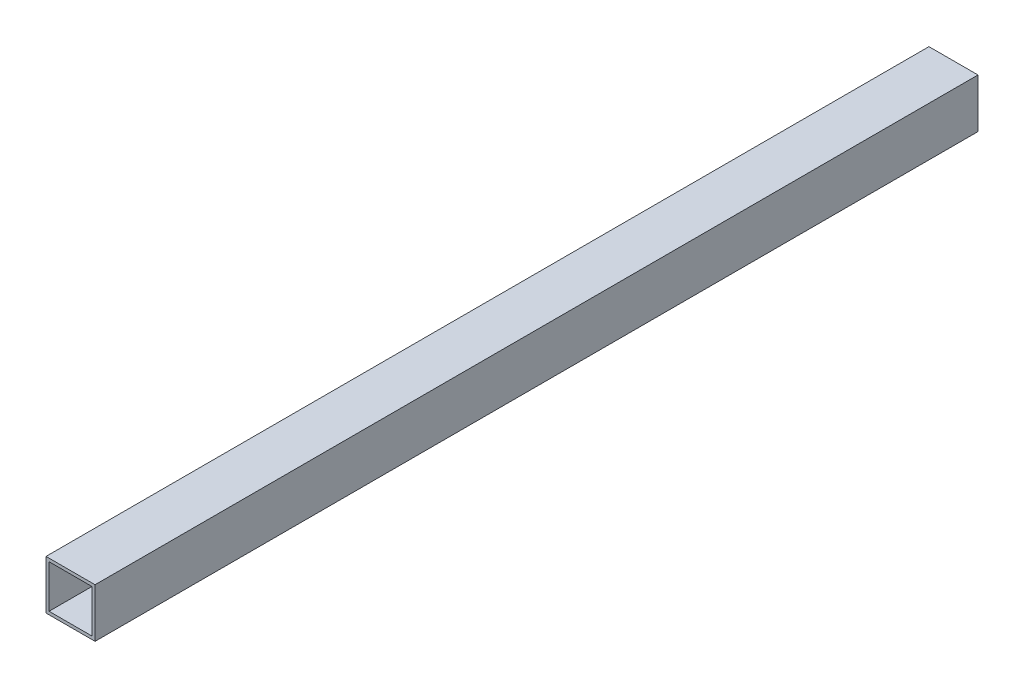
ISO-10303-21;
HEADER;
FILE_DESCRIPTION(('STEP AP214'),'2;1');
FILE_NAME('part.step','',(''),(''),'','','');
FILE_SCHEMA(('AUTOMOTIVE_DESIGN { 1 0 10303 214 1 1 1 1 }'));
ENDSEC;
DATA;
#1=APPLICATION_CONTEXT('core data for automotive mechanical design processes');
#2=APPLICATION_PROTOCOL_DEFINITION('international standard','automotive_design',2000,#1);
#3=PRODUCT_CONTEXT('',#1,'mechanical');
#4=PRODUCT('Part','Part','',(#3));
#5=PRODUCT_RELATED_PRODUCT_CATEGORY('part','',(#4));
#6=PRODUCT_DEFINITION_FORMATION('','',#4);
#7=PRODUCT_DEFINITION_CONTEXT('part definition',#1,'design');
#8=PRODUCT_DEFINITION('design','',#6,#7);
#9=PRODUCT_DEFINITION_SHAPE('','',#8);
#10=(LENGTH_UNIT() NAMED_UNIT(*) SI_UNIT(.MILLI.,.METRE.));
#11=(NAMED_UNIT(*) PLANE_ANGLE_UNIT() SI_UNIT($,.RADIAN.));
#12=(NAMED_UNIT(*) SI_UNIT($,.STERADIAN.) SOLID_ANGLE_UNIT());
#13=UNCERTAINTY_MEASURE_WITH_UNIT(LENGTH_MEASURE(1.E-05),#10,'distance_accuracy_value','');
#14=(GEOMETRIC_REPRESENTATION_CONTEXT(3) GLOBAL_UNCERTAINTY_ASSIGNED_CONTEXT((#13)) GLOBAL_UNIT_ASSIGNED_CONTEXT((#10,
#11,#12)) REPRESENTATION_CONTEXT('',''));
#15=CARTESIAN_POINT('',(0.,0.,0.));
#16=DIRECTION('',(0.,0.,1.));
#17=DIRECTION('',(1.,0.,0.));
#18=AXIS2_PLACEMENT_3D('',#15,#16,#17);
#19=CARTESIAN_POINT('',(0.,0.,457.2));
#20=DIRECTION('',(0.,0.,1.));
#21=DIRECTION('',(1.,0.,0.));
#22=AXIS2_PLACEMENT_3D('',#19,#20,#21);
#23=PLANE('',#22);
#24=DIRECTION('',(0.,-1.,0.));
#25=VECTOR('',#24,1.);
#26=CARTESIAN_POINT('',(-12.7,-12.7,457.2));
#27=LINE('',#26,#25);
#28=CARTESIAN_POINT('',(-12.7,12.7,457.2));
#29=VERTEX_POINT('',#28);
#30=CARTESIAN_POINT('',(-12.7,-12.7,457.2));
#31=VERTEX_POINT('',#30);
#32=EDGE_CURVE('E181',#29,#31,#27,.T.);
#33=ORIENTED_EDGE('',*,*,#32,.T.);
#34=DIRECTION('',(1.,0.,0.));
#35=VECTOR('',#34,1.);
#36=CARTESIAN_POINT('',(12.7,-12.7,457.2));
#37=LINE('',#36,#35);
#38=CARTESIAN_POINT('',(12.7,-12.7,457.2));
#39=VERTEX_POINT('',#38);
#40=EDGE_CURVE('E185',#31,#39,#37,.T.);
#41=ORIENTED_EDGE('',*,*,#40,.T.);
#42=DIRECTION('',(0.,1.,0.));
#43=VECTOR('',#42,1.);
#44=CARTESIAN_POINT('',(12.7,-12.7,457.2));
#45=LINE('',#44,#43);
#46=CARTESIAN_POINT('',(12.7,12.7,457.2));
#47=VERTEX_POINT('',#46);
#48=EDGE_CURVE('E189',#39,#47,#45,.T.);
#49=ORIENTED_EDGE('',*,*,#48,.T.);
#50=DIRECTION('',(-1.,0.,0.));
#51=VECTOR('',#50,1.);
#52=CARTESIAN_POINT('',(12.7,12.7,457.2));
#53=LINE('',#52,#51);
#54=EDGE_CURVE('E192',#47,#29,#53,.T.);
#55=ORIENTED_EDGE('',*,*,#54,.T.);
#56=EDGE_LOOP('',(#33,#41,#49,#55));
#57=FACE_BOUND('',#56,.T.);
#58=DIRECTION('',(1.,0.,0.));
#59=VECTOR('',#58,1.);
#60=CARTESIAN_POINT('',(12.7,-11.1125,457.2));
#61=LINE('',#60,#59);
#62=CARTESIAN_POINT('',(-11.1125,-11.1125,457.2));
#63=VERTEX_POINT('',#62);
#64=CARTESIAN_POINT('',(11.1125,-11.1125,457.2));
#65=VERTEX_POINT('',#64);
#66=EDGE_CURVE('E142',#63,#65,#61,.T.);
#67=ORIENTED_EDGE('',*,*,#66,.F.);
#68=DIRECTION('',(0.,-1.,0.));
#69=VECTOR('',#68,1.);
#70=CARTESIAN_POINT('',(-11.1125,-12.7,457.2));
#71=LINE('',#70,#69);
#72=CARTESIAN_POINT('',(-11.1125,11.1125,457.2));
#73=VERTEX_POINT('',#72);
#74=EDGE_CURVE('E133',#73,#63,#71,.T.);
#75=ORIENTED_EDGE('',*,*,#74,.F.);
#76=DIRECTION('',(-1.,0.,0.));
#77=VECTOR('',#76,1.);
#78=CARTESIAN_POINT('',(12.7,11.1125,457.2));
#79=LINE('',#78,#77);
#80=CARTESIAN_POINT('',(11.1125,11.1125,457.2));
#81=VERTEX_POINT('',#80);
#82=EDGE_CURVE('E159',#81,#73,#79,.T.);
#83=ORIENTED_EDGE('',*,*,#82,.F.);
#84=DIRECTION('',(0.,1.,0.));
#85=VECTOR('',#84,1.);
#86=CARTESIAN_POINT('',(11.1125,-12.7,457.2));
#87=LINE('',#86,#85);
#88=EDGE_CURVE('E155',#65,#81,#87,.T.);
#89=ORIENTED_EDGE('',*,*,#88,.F.);
#90=EDGE_LOOP('',(#67,#75,#83,#89));
#91=FACE_BOUND('',#90,.T.);
#92=ADVANCED_FACE('F67',(#57,#91),#23,.T.);
#93=CARTESIAN_POINT('',(0.,0.,0.));
#94=DIRECTION('',(0.,0.,1.));
#95=DIRECTION('',(1.,0.,0.));
#96=AXIS2_PLACEMENT_3D('',#93,#94,#95);
#97=PLANE('',#96);
#98=DIRECTION('',(0.,-1.,0.));
#99=VECTOR('',#98,1.);
#100=CARTESIAN_POINT('',(-12.7,-12.7,0.));
#101=LINE('',#100,#99);
#102=CARTESIAN_POINT('',(-12.7,12.7,0.));
#103=VERTEX_POINT('',#102);
#104=CARTESIAN_POINT('',(-12.7,-12.7,0.));
#105=VERTEX_POINT('',#104);
#106=EDGE_CURVE('E151',#103,#105,#101,.T.);
#107=ORIENTED_EDGE('',*,*,#106,.F.);
#108=DIRECTION('',(-1.,0.,0.));
#109=VECTOR('',#108,1.);
#110=CARTESIAN_POINT('',(12.7,12.7,0.));
#111=LINE('',#110,#109);
#112=CARTESIAN_POINT('',(12.7,12.7,0.));
#113=VERTEX_POINT('',#112);
#114=EDGE_CURVE('E186',#113,#103,#111,.T.);
#115=ORIENTED_EDGE('',*,*,#114,.F.);
#116=DIRECTION('',(0.,1.,0.));
#117=VECTOR('',#116,1.);
#118=CARTESIAN_POINT('',(12.7,-12.7,0.));
#119=LINE('',#118,#117);
#120=CARTESIAN_POINT('',(12.7,-12.7,0.));
#121=VERTEX_POINT('',#120);
#122=EDGE_CURVE('E202',#121,#113,#119,.T.);
#123=ORIENTED_EDGE('',*,*,#122,.F.);
#124=DIRECTION('',(1.,0.,0.));
#125=VECTOR('',#124,1.);
#126=CARTESIAN_POINT('',(12.7,-12.7,0.));
#127=LINE('',#126,#125);
#128=EDGE_CURVE('E199',#105,#121,#127,.T.);
#129=ORIENTED_EDGE('',*,*,#128,.F.);
#130=EDGE_LOOP('',(#107,#115,#123,#129));
#131=FACE_BOUND('',#130,.T.);
#132=DIRECTION('',(0.,-1.,0.));
#133=VECTOR('',#132,1.);
#134=CARTESIAN_POINT('',(-11.1125,-12.7,0.));
#135=LINE('',#134,#133);
#136=CARTESIAN_POINT('',(-11.1125,11.1125,0.));
#137=VERTEX_POINT('',#136);
#138=CARTESIAN_POINT('',(-11.1125,-11.1125,0.));
#139=VERTEX_POINT('',#138);
#140=EDGE_CURVE('E91',#137,#139,#135,.T.);
#141=ORIENTED_EDGE('',*,*,#140,.T.);
#142=DIRECTION('',(1.,0.,0.));
#143=VECTOR('',#142,1.);
#144=CARTESIAN_POINT('',(12.7,-11.1125,0.));
#145=LINE('',#144,#143);
#146=CARTESIAN_POINT('',(11.1125,-11.1125,0.));
#147=VERTEX_POINT('',#146);
#148=EDGE_CURVE('E149',#139,#147,#145,.T.);
#149=ORIENTED_EDGE('',*,*,#148,.T.);
#150=DIRECTION('',(0.,1.,0.));
#151=VECTOR('',#150,1.);
#152=CARTESIAN_POINT('',(11.1125,-12.7,0.));
#153=LINE('',#152,#151);
#154=CARTESIAN_POINT('',(11.1125,11.1125,0.));
#155=VERTEX_POINT('',#154);
#156=EDGE_CURVE('E168',#147,#155,#153,.T.);
#157=ORIENTED_EDGE('',*,*,#156,.T.);
#158=DIRECTION('',(-1.,0.,0.));
#159=VECTOR('',#158,1.);
#160=CARTESIAN_POINT('',(12.7,11.1125,0.));
#161=LINE('',#160,#159);
#162=EDGE_CURVE('E143',#155,#137,#161,.T.);
#163=ORIENTED_EDGE('',*,*,#162,.T.);
#164=EDGE_LOOP('',(#141,#149,#157,#163));
#165=FACE_BOUND('',#164,.T.);
#166=ADVANCED_FACE('F225',(#131,#165),#97,.F.);
#167=CARTESIAN_POINT('',(-12.7,-12.7,457.2));
#168=DIRECTION('',(1.,0.,0.));
#169=DIRECTION('',(0.,0.,-1.));
#170=AXIS2_PLACEMENT_3D('',#167,#168,#169);
#171=PLANE('',#170);
#172=ORIENTED_EDGE('',*,*,#106,.T.);
#173=DIRECTION('',(0.,0.,-1.));
#174=VECTOR('',#173,1.);
#175=CARTESIAN_POINT('',(-12.7,-12.7,457.2));
#176=LINE('',#175,#174);
#177=EDGE_CURVE('E12',#31,#105,#176,.T.);
#178=ORIENTED_EDGE('',*,*,#177,.F.);
#179=ORIENTED_EDGE('',*,*,#32,.F.);
#180=DIRECTION('',(0.,0.,-1.));
#181=VECTOR('',#180,1.);
#182=CARTESIAN_POINT('',(-12.7,12.7,457.2));
#183=LINE('',#182,#181);
#184=EDGE_CURVE('E195',#29,#103,#183,.T.);
#185=ORIENTED_EDGE('',*,*,#184,.T.);
#186=EDGE_LOOP('',(#172,#178,#179,#185));
#187=FACE_BOUND('',#186,.T.);
#188=ADVANCED_FACE('F69',(#187),#171,.F.);
#189=CARTESIAN_POINT('',(12.7,-12.7,457.2));
#190=DIRECTION('',(0.,1.,0.));
#191=DIRECTION('',(-1.,0.,0.));
#192=AXIS2_PLACEMENT_3D('',#189,#190,#191);
#193=PLANE('',#192);
#194=ORIENTED_EDGE('',*,*,#128,.T.);
#195=DIRECTION('',(0.,0.,-1.));
#196=VECTOR('',#195,1.);
#197=CARTESIAN_POINT('',(12.7,-12.7,457.2));
#198=LINE('',#197,#196);
#199=EDGE_CURVE('E76',#39,#121,#198,.T.);
#200=ORIENTED_EDGE('',*,*,#199,.F.);
#201=ORIENTED_EDGE('',*,*,#40,.F.);
#202=ORIENTED_EDGE('',*,*,#177,.T.);
#203=EDGE_LOOP('',(#194,#200,#201,#202));
#204=FACE_BOUND('',#203,.T.);
#205=ADVANCED_FACE('F235',(#204),#193,.F.);
#206=CARTESIAN_POINT('',(12.7,-12.7,457.2));
#207=DIRECTION('',(-1.,0.,0.));
#208=DIRECTION('',(0.,0.,1.));
#209=AXIS2_PLACEMENT_3D('',#206,#207,#208);
#210=PLANE('',#209);
#211=ORIENTED_EDGE('',*,*,#122,.T.);
#212=DIRECTION('',(0.,0.,-1.));
#213=VECTOR('',#212,1.);
#214=CARTESIAN_POINT('',(12.7,12.7,457.2));
#215=LINE('',#214,#213);
#216=EDGE_CURVE('E210',#47,#113,#215,.T.);
#217=ORIENTED_EDGE('',*,*,#216,.F.);
#218=ORIENTED_EDGE('',*,*,#48,.F.);
#219=ORIENTED_EDGE('',*,*,#199,.T.);
#220=EDGE_LOOP('',(#211,#217,#218,#219));
#221=FACE_BOUND('',#220,.T.);
#222=ADVANCED_FACE('F219',(#221),#210,.F.);
#223=CARTESIAN_POINT('',(12.7,12.7,457.2));
#224=DIRECTION('',(0.,-1.,0.));
#225=DIRECTION('',(1.,0.,0.));
#226=AXIS2_PLACEMENT_3D('',#223,#224,#225);
#227=PLANE('',#226);
#228=ORIENTED_EDGE('',*,*,#114,.T.);
#229=ORIENTED_EDGE('',*,*,#184,.F.);
#230=ORIENTED_EDGE('',*,*,#54,.F.);
#231=ORIENTED_EDGE('',*,*,#216,.T.);
#232=EDGE_LOOP('',(#228,#229,#230,#231));
#233=FACE_BOUND('',#232,.T.);
#234=ADVANCED_FACE('F229',(#233),#227,.F.);
#235=CARTESIAN_POINT('',(-11.1125,-12.7,457.2));
#236=DIRECTION('',(1.,0.,0.));
#237=DIRECTION('',(0.,0.,-1.));
#238=AXIS2_PLACEMENT_3D('',#235,#236,#237);
#239=PLANE('',#238);
#240=ORIENTED_EDGE('',*,*,#140,.F.);
#241=DIRECTION('',(0.,0.,-1.));
#242=VECTOR('',#241,1.);
#243=CARTESIAN_POINT('',(-11.1125,11.1125,457.2));
#244=LINE('',#243,#242);
#245=EDGE_CURVE('E137',#73,#137,#244,.T.);
#246=ORIENTED_EDGE('',*,*,#245,.F.);
#247=ORIENTED_EDGE('',*,*,#74,.T.);
#248=DIRECTION('',(0.,0.,-1.));
#249=VECTOR('',#248,1.);
#250=CARTESIAN_POINT('',(-11.1125,-11.1125,457.2));
#251=LINE('',#250,#249);
#252=EDGE_CURVE('E136',#63,#139,#251,.T.);
#253=ORIENTED_EDGE('',*,*,#252,.T.);
#254=EDGE_LOOP('',(#240,#246,#247,#253));
#255=FACE_BOUND('',#254,.T.);
#256=ADVANCED_FACE('F135',(#255),#239,.T.);
#257=CARTESIAN_POINT('',(12.7,-11.1125,457.2));
#258=DIRECTION('',(0.,1.,0.));
#259=DIRECTION('',(-1.,0.,0.));
#260=AXIS2_PLACEMENT_3D('',#257,#258,#259);
#261=PLANE('',#260);
#262=ORIENTED_EDGE('',*,*,#148,.F.);
#263=ORIENTED_EDGE('',*,*,#252,.F.);
#264=ORIENTED_EDGE('',*,*,#66,.T.);
#265=DIRECTION('',(0.,0.,-1.));
#266=VECTOR('',#265,1.);
#267=CARTESIAN_POINT('',(11.1125,-11.1125,457.2));
#268=LINE('',#267,#266);
#269=EDGE_CURVE('E152',#65,#147,#268,.T.);
#270=ORIENTED_EDGE('',*,*,#269,.T.);
#271=EDGE_LOOP('',(#262,#263,#264,#270));
#272=FACE_BOUND('',#271,.T.);
#273=ADVANCED_FACE('F146',(#272),#261,.T.);
#274=CARTESIAN_POINT('',(11.1125,-12.7,457.2));
#275=DIRECTION('',(-1.,0.,0.));
#276=DIRECTION('',(0.,0.,1.));
#277=AXIS2_PLACEMENT_3D('',#274,#275,#276);
#278=PLANE('',#277);
#279=ORIENTED_EDGE('',*,*,#156,.F.);
#280=ORIENTED_EDGE('',*,*,#269,.F.);
#281=ORIENTED_EDGE('',*,*,#88,.T.);
#282=DIRECTION('',(0.,0.,-1.));
#283=VECTOR('',#282,1.);
#284=CARTESIAN_POINT('',(11.1125,11.1125,457.2));
#285=LINE('',#284,#283);
#286=EDGE_CURVE('E83',#81,#155,#285,.T.);
#287=ORIENTED_EDGE('',*,*,#286,.T.);
#288=EDGE_LOOP('',(#279,#280,#281,#287));
#289=FACE_BOUND('',#288,.T.);
#290=ADVANCED_FACE('F258',(#289),#278,.T.);
#291=CARTESIAN_POINT('',(12.7,11.1125,457.2));
#292=DIRECTION('',(0.,-1.,0.));
#293=DIRECTION('',(1.,0.,0.));
#294=AXIS2_PLACEMENT_3D('',#291,#292,#293);
#295=PLANE('',#294);
#296=ORIENTED_EDGE('',*,*,#162,.F.);
#297=ORIENTED_EDGE('',*,*,#286,.F.);
#298=ORIENTED_EDGE('',*,*,#82,.T.);
#299=ORIENTED_EDGE('',*,*,#245,.T.);
#300=EDGE_LOOP('',(#296,#297,#298,#299));
#301=FACE_BOUND('',#300,.T.);
#302=ADVANCED_FACE('F262',(#301),#295,.T.);
#303=CLOSED_SHELL('',(#92,#166,#188,#205,#222,#234,#256,#273,#290,#302));
#304=MANIFOLD_SOLID_BREP('B2',#303);
#305=ADVANCED_BREP_SHAPE_REPRESENTATION('',(#18,#304),#14);
#306=SHAPE_DEFINITION_REPRESENTATION(#9,#305);
ENDSEC;
END-ISO-10303-21;
